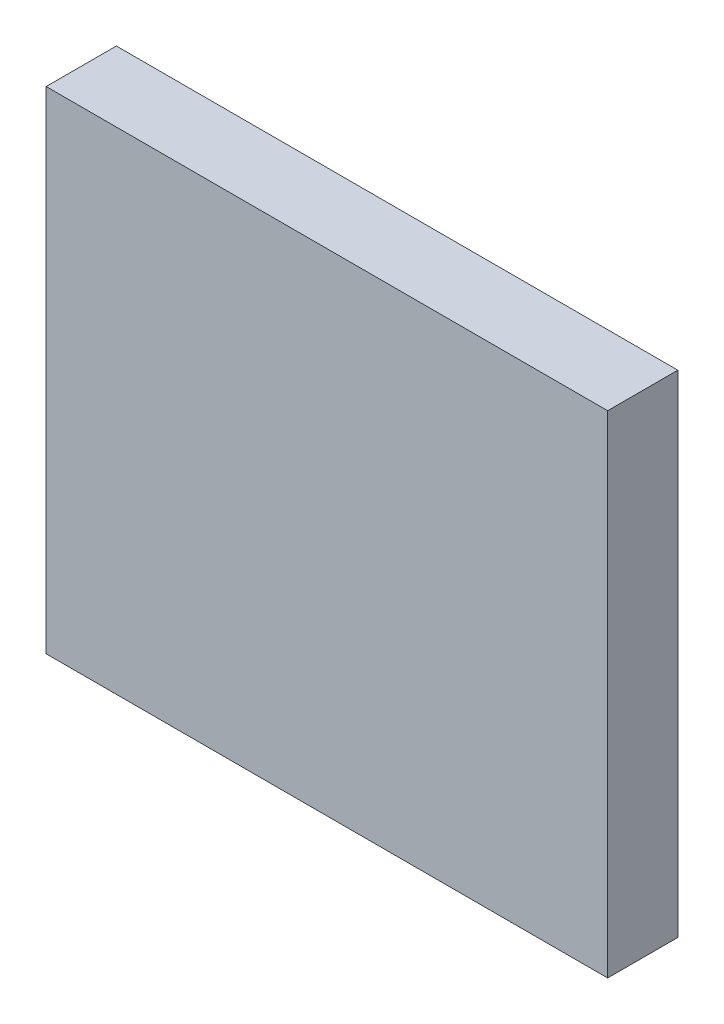
ISO-10303-21;
HEADER;
FILE_DESCRIPTION(('STEP AP214'),'2;1');
FILE_NAME('part.step','',(''),(''),'','','');
FILE_SCHEMA(('AUTOMOTIVE_DESIGN { 1 0 10303 214 1 1 1 1 }'));
ENDSEC;
DATA;
#1=APPLICATION_CONTEXT('core data for automotive mechanical design processes');
#2=APPLICATION_PROTOCOL_DEFINITION('international standard','automotive_design',2000,#1);
#3=PRODUCT_CONTEXT('',#1,'mechanical');
#4=PRODUCT('Part','Part','',(#3));
#5=PRODUCT_RELATED_PRODUCT_CATEGORY('part','',(#4));
#6=PRODUCT_DEFINITION_FORMATION('','',#4);
#7=PRODUCT_DEFINITION_CONTEXT('part definition',#1,'design');
#8=PRODUCT_DEFINITION('design','',#6,#7);
#9=PRODUCT_DEFINITION_SHAPE('','',#8);
#10=(LENGTH_UNIT() NAMED_UNIT(*) SI_UNIT(.MILLI.,.METRE.));
#11=(NAMED_UNIT(*) PLANE_ANGLE_UNIT() SI_UNIT($,.RADIAN.));
#12=(NAMED_UNIT(*) SI_UNIT($,.STERADIAN.) SOLID_ANGLE_UNIT());
#13=UNCERTAINTY_MEASURE_WITH_UNIT(LENGTH_MEASURE(1.E-05),#10,'distance_accuracy_value','');
#14=(GEOMETRIC_REPRESENTATION_CONTEXT(3) GLOBAL_UNCERTAINTY_ASSIGNED_CONTEXT((#13)) GLOBAL_UNIT_ASSIGNED_CONTEXT((#10,
#11,#12)) REPRESENTATION_CONTEXT('',''));
#15=CARTESIAN_POINT('',(0.,0.,0.));
#16=DIRECTION('',(0.,0.,1.));
#17=DIRECTION('',(1.,0.,0.));
#18=AXIS2_PLACEMENT_3D('',#15,#16,#17);
#19=CARTESIAN_POINT('',(0.,0.,5.));
#20=DIRECTION('',(1.,0.,0.));
#21=DIRECTION('',(0.,0.,-1.));
#22=AXIS2_PLACEMENT_3D('',#19,#20,#21);
#23=PLANE('',#22);
#24=DIRECTION('',(0.,-1.,0.));
#25=VECTOR('',#24,1.);
#26=CARTESIAN_POINT('',(0.,0.,0.));
#27=LINE('',#26,#25);
#28=CARTESIAN_POINT('',(0.,35.,0.));
#29=VERTEX_POINT('',#28);
#30=CARTESIAN_POINT('',(0.,0.,0.));
#31=VERTEX_POINT('',#30);
#32=EDGE_CURVE('E96',#29,#31,#27,.T.);
#33=ORIENTED_EDGE('',*,*,#32,.T.);
#34=DIRECTION('',(0.,0.,-1.));
#35=VECTOR('',#34,1.);
#36=CARTESIAN_POINT('',(0.,0.,5.));
#37=LINE('',#36,#35);
#38=CARTESIAN_POINT('',(0.,0.,5.));
#39=VERTEX_POINT('',#38);
#40=EDGE_CURVE('E11',#39,#31,#37,.T.);
#41=ORIENTED_EDGE('',*,*,#40,.F.);
#42=DIRECTION('',(0.,-1.,0.));
#43=VECTOR('',#42,1.);
#44=CARTESIAN_POINT('',(0.,0.,5.));
#45=LINE('',#44,#43);
#46=CARTESIAN_POINT('',(0.,35.,5.));
#47=VERTEX_POINT('',#46);
#48=EDGE_CURVE('E84',#47,#39,#45,.T.);
#49=ORIENTED_EDGE('',*,*,#48,.F.);
#50=DIRECTION('',(0.,0.,-1.));
#51=VECTOR('',#50,1.);
#52=CARTESIAN_POINT('',(0.,35.,5.));
#53=LINE('',#52,#51);
#54=EDGE_CURVE('E92',#47,#29,#53,.T.);
#55=ORIENTED_EDGE('',*,*,#54,.T.);
#56=EDGE_LOOP('',(#33,#41,#49,#55));
#57=FACE_BOUND('',#56,.T.);
#58=ADVANCED_FACE('F33',(#57),#23,.F.);
#59=CARTESIAN_POINT('',(0.,0.,5.));
#60=DIRECTION('',(0.,1.,0.));
#61=DIRECTION('',(0.,0.,1.));
#62=AXIS2_PLACEMENT_3D('',#59,#60,#61);
#63=PLANE('',#62);
#64=DIRECTION('',(1.,0.,0.));
#65=VECTOR('',#64,1.);
#66=CARTESIAN_POINT('',(0.,0.,0.));
#67=LINE('',#66,#65);
#68=CARTESIAN_POINT('',(40.,0.,0.));
#69=VERTEX_POINT('',#68);
#70=EDGE_CURVE('E88',#31,#69,#67,.T.);
#71=ORIENTED_EDGE('',*,*,#70,.T.);
#72=DIRECTION('',(0.,0.,-1.));
#73=VECTOR('',#72,1.);
#74=CARTESIAN_POINT('',(40.,0.,5.));
#75=LINE('',#74,#73);
#76=CARTESIAN_POINT('',(40.,0.,5.));
#77=VERTEX_POINT('',#76);
#78=EDGE_CURVE('E41',#77,#69,#75,.T.);
#79=ORIENTED_EDGE('',*,*,#78,.F.);
#80=DIRECTION('',(1.,0.,0.));
#81=VECTOR('',#80,1.);
#82=CARTESIAN_POINT('',(0.,0.,5.));
#83=LINE('',#82,#81);
#84=EDGE_CURVE('E79',#39,#77,#83,.T.);
#85=ORIENTED_EDGE('',*,*,#84,.F.);
#86=ORIENTED_EDGE('',*,*,#40,.T.);
#87=EDGE_LOOP('',(#71,#79,#85,#86));
#88=FACE_BOUND('',#87,.T.);
#89=ADVANCED_FACE('F87',(#88),#63,.F.);
#90=CARTESIAN_POINT('',(40.,0.,5.));
#91=DIRECTION('',(-1.,0.,0.));
#92=DIRECTION('',(0.,0.,1.));
#93=AXIS2_PLACEMENT_3D('',#90,#91,#92);
#94=PLANE('',#93);
#95=DIRECTION('',(0.,1.,0.));
#96=VECTOR('',#95,1.);
#97=CARTESIAN_POINT('',(40.,0.,0.));
#98=LINE('',#97,#96);
#99=CARTESIAN_POINT('',(40.,35.,0.));
#100=VERTEX_POINT('',#99);
#101=EDGE_CURVE('E66',#69,#100,#98,.T.);
#102=ORIENTED_EDGE('',*,*,#101,.T.);
#103=DIRECTION('',(0.,0.,-1.));
#104=VECTOR('',#103,1.);
#105=CARTESIAN_POINT('',(40.,35.,5.));
#106=LINE('',#105,#104);
#107=CARTESIAN_POINT('',(40.,35.,5.));
#108=VERTEX_POINT('',#107);
#109=EDGE_CURVE('E89',#108,#100,#106,.T.);
#110=ORIENTED_EDGE('',*,*,#109,.F.);
#111=DIRECTION('',(0.,1.,0.));
#112=VECTOR('',#111,1.);
#113=CARTESIAN_POINT('',(40.,0.,5.));
#114=LINE('',#113,#112);
#115=EDGE_CURVE('E82',#77,#108,#114,.T.);
#116=ORIENTED_EDGE('',*,*,#115,.F.);
#117=ORIENTED_EDGE('',*,*,#78,.T.);
#118=EDGE_LOOP('',(#102,#110,#116,#117));
#119=FACE_BOUND('',#118,.T.);
#120=ADVANCED_FACE('F90',(#119),#94,.F.);
#121=CARTESIAN_POINT('',(0.,35.,5.));
#122=DIRECTION('',(0.,-1.,0.));
#123=DIRECTION('',(0.,0.,-1.));
#124=AXIS2_PLACEMENT_3D('',#121,#122,#123);
#125=PLANE('',#124);
#126=DIRECTION('',(-1.,0.,0.));
#127=VECTOR('',#126,1.);
#128=CARTESIAN_POINT('',(0.,35.,0.));
#129=LINE('',#128,#127);
#130=EDGE_CURVE('E72',#100,#29,#129,.T.);
#131=ORIENTED_EDGE('',*,*,#130,.T.);
#132=ORIENTED_EDGE('',*,*,#54,.F.);
#133=DIRECTION('',(-1.,0.,0.));
#134=VECTOR('',#133,1.);
#135=CARTESIAN_POINT('',(0.,35.,5.));
#136=LINE('',#135,#134);
#137=EDGE_CURVE('E49',#108,#47,#136,.T.);
#138=ORIENTED_EDGE('',*,*,#137,.F.);
#139=ORIENTED_EDGE('',*,*,#109,.T.);
#140=EDGE_LOOP('',(#131,#132,#138,#139));
#141=FACE_BOUND('',#140,.T.);
#142=ADVANCED_FACE('F103',(#141),#125,.F.);
#143=CARTESIAN_POINT('',(0.,0.,5.));
#144=DIRECTION('',(0.,0.,-1.));
#145=DIRECTION('',(-1.,0.,0.));
#146=AXIS2_PLACEMENT_3D('',#143,#144,#145);
#147=PLANE('',#146);
#148=ORIENTED_EDGE('',*,*,#48,.T.);
#149=ORIENTED_EDGE('',*,*,#84,.T.);
#150=ORIENTED_EDGE('',*,*,#115,.T.);
#151=ORIENTED_EDGE('',*,*,#137,.T.);
#152=EDGE_LOOP('',(#148,#149,#150,#151));
#153=FACE_BOUND('',#152,.T.);
#154=ADVANCED_FACE('F80',(#153),#147,.F.);
#155=CARTESIAN_POINT('',(0.,0.,0.));
#156=DIRECTION('',(0.,0.,-1.));
#157=DIRECTION('',(-1.,0.,0.));
#158=AXIS2_PLACEMENT_3D('',#155,#156,#157);
#159=PLANE('',#158);
#160=ORIENTED_EDGE('',*,*,#32,.F.);
#161=ORIENTED_EDGE('',*,*,#130,.F.);
#162=ORIENTED_EDGE('',*,*,#101,.F.);
#163=ORIENTED_EDGE('',*,*,#70,.F.);
#164=EDGE_LOOP('',(#160,#161,#162,#163));
#165=FACE_BOUND('',#164,.T.);
#166=ADVANCED_FACE('F106',(#165),#159,.T.);
#167=CLOSED_SHELL('',(#58,#89,#120,#142,#154,#166));
#168=MANIFOLD_SOLID_BREP('B2',#167);
#169=ADVANCED_BREP_SHAPE_REPRESENTATION('',(#18,#168),#14);
#170=SHAPE_DEFINITION_REPRESENTATION(#9,#169);
ENDSEC;
END-ISO-10303-21;
